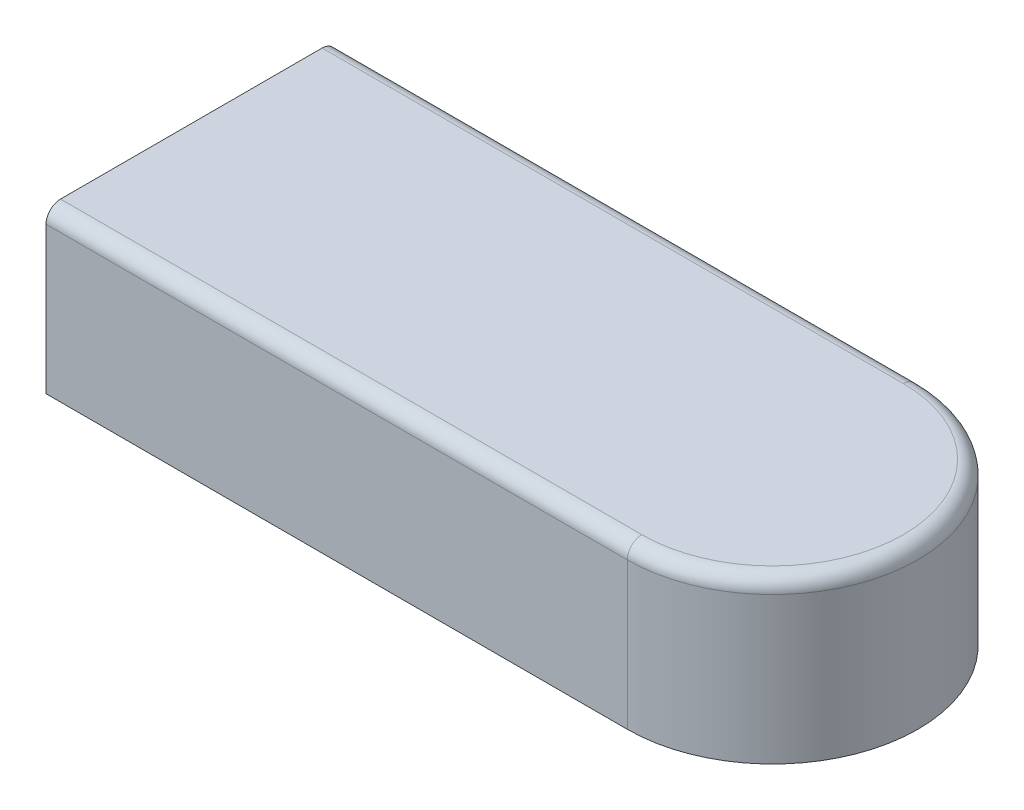
ISO-10303-21;
HEADER;
FILE_DESCRIPTION(('STEP AP214'),'2;1');
FILE_NAME('part.step','',(''),(''),'','','');
FILE_SCHEMA(('AUTOMOTIVE_DESIGN { 1 0 10303 214 1 1 1 1 }'));
ENDSEC;
DATA;
#1=APPLICATION_CONTEXT('core data for automotive mechanical design processes');
#2=APPLICATION_PROTOCOL_DEFINITION('international standard','automotive_design',2000,#1);
#3=PRODUCT_CONTEXT('',#1,'mechanical');
#4=PRODUCT('Part','Part','',(#3));
#5=PRODUCT_RELATED_PRODUCT_CATEGORY('part','',(#4));
#6=PRODUCT_DEFINITION_FORMATION('','',#4);
#7=PRODUCT_DEFINITION_CONTEXT('part definition',#1,'design');
#8=PRODUCT_DEFINITION('design','',#6,#7);
#9=PRODUCT_DEFINITION_SHAPE('','',#8);
#10=(LENGTH_UNIT() NAMED_UNIT(*) SI_UNIT(.MILLI.,.METRE.));
#11=(NAMED_UNIT(*) PLANE_ANGLE_UNIT() SI_UNIT($,.RADIAN.));
#12=(NAMED_UNIT(*) SI_UNIT($,.STERADIAN.) SOLID_ANGLE_UNIT());
#13=UNCERTAINTY_MEASURE_WITH_UNIT(LENGTH_MEASURE(1.E-05),#10,'distance_accuracy_value','');
#14=(GEOMETRIC_REPRESENTATION_CONTEXT(3) GLOBAL_UNCERTAINTY_ASSIGNED_CONTEXT((#13)) GLOBAL_UNIT_ASSIGNED_CONTEXT((#10,
#11,#12)) REPRESENTATION_CONTEXT('',''));
#15=CARTESIAN_POINT('',(0.,0.,0.));
#16=DIRECTION('',(0.,0.,1.));
#17=DIRECTION('',(1.,0.,0.));
#18=AXIS2_PLACEMENT_3D('',#15,#16,#17);
#19=CARTESIAN_POINT('',(56.6212046767663,-2.79399999999999,-12.9306309994996));
#20=DIRECTION('',(0.,1.,0.));
#21=DIRECTION('',(0.,0.,1.));
#22=AXIS2_PLACEMENT_3D('',#19,#20,#21);
#23=CYLINDRICAL_SURFACE('',#22,25.4);
#24=DIRECTION('',(0.,1.,0.));
#25=VECTOR('',#24,1.);
#26=CARTESIAN_POINT('',(56.6212046767663,-2.79399999999999,-38.3306309994996));
#27=LINE('',#26,#25);
#28=CARTESIAN_POINT('',(56.6212046767663,-2.79399999999999,-38.3306309994996));
#29=VERTEX_POINT('',#28);
#30=CARTESIAN_POINT('',(56.6212046767663,22.86,-38.3306309994996));
#31=VERTEX_POINT('',#30);
#32=EDGE_CURVE('E101',#29,#31,#27,.T.);
#33=ORIENTED_EDGE('',*,*,#32,.T.);
#34=CARTESIAN_POINT('',(56.6212046767663,22.86,-12.9306309994996));
#35=DIRECTION('',(0.,1.,0.));
#36=DIRECTION('',(0.,0.,1.));
#37=AXIS2_PLACEMENT_3D('',#34,#35,#36);
#38=CIRCLE('',#37,25.4);
#39=CARTESIAN_POINT('',(56.6212046767663,22.86,12.4693690005004));
#40=VERTEX_POINT('',#39);
#41=EDGE_CURVE('E46',#31,#40,#38,.F.);
#42=ORIENTED_EDGE('',*,*,#41,.T.);
#43=DIRECTION('',(0.,1.,0.));
#44=VECTOR('',#43,1.);
#45=CARTESIAN_POINT('',(56.6212046767663,-2.79399999999999,12.4693690005004));
#46=LINE('',#45,#44);
#47=CARTESIAN_POINT('',(56.6212046767663,-2.79399999999999,12.4693690005004));
#48=VERTEX_POINT('',#47);
#49=EDGE_CURVE('E109',#48,#40,#46,.T.);
#50=ORIENTED_EDGE('',*,*,#49,.F.);
#51=CARTESIAN_POINT('',(56.6212046767663,-2.79399999999999,-12.9306309994996));
#52=DIRECTION('',(0.,1.,0.));
#53=DIRECTION('',(0.,0.,1.));
#54=AXIS2_PLACEMENT_3D('',#51,#52,#53);
#55=CIRCLE('',#54,25.4);
#56=EDGE_CURVE('E96',#29,#48,#55,.F.);
#57=ORIENTED_EDGE('',*,*,#56,.F.);
#58=EDGE_LOOP('',(#33,#42,#50,#57));
#59=FACE_BOUND('',#58,.T.);
#60=ADVANCED_FACE('F37',(#59),#23,.T.);
#61=CARTESIAN_POINT('',(0.,-2.79399999999999,12.4693690005004));
#62=DIRECTION('',(0.,0.,1.));
#63=DIRECTION('',(1.,0.,0.));
#64=AXIS2_PLACEMENT_3D('',#61,#62,#63);
#65=PLANE('',#64);
#66=ORIENTED_EDGE('',*,*,#49,.T.);
#67=DIRECTION('',(1.,0.,0.));
#68=VECTOR('',#67,1.);
#69=CARTESIAN_POINT('',(0.,22.86,12.4693690005004));
#70=LINE('',#69,#68);
#71=CARTESIAN_POINT('',(-44.9787953232337,22.86,12.4693690005004));
#72=VERTEX_POINT('',#71);
#73=EDGE_CURVE('E130',#40,#72,#70,.F.);
#74=ORIENTED_EDGE('',*,*,#73,.T.);
#75=DIRECTION('',(0.,1.,0.));
#76=VECTOR('',#75,1.);
#77=CARTESIAN_POINT('',(-44.9787953232337,-2.79399999999999,12.4693690005004));
#78=LINE('',#77,#76);
#79=CARTESIAN_POINT('',(-44.9787953232337,-2.79399999999999,12.4693690005004));
#80=VERTEX_POINT('',#79);
#81=EDGE_CURVE('E120',#80,#72,#78,.T.);
#82=ORIENTED_EDGE('',*,*,#81,.F.);
#83=DIRECTION('',(1.,0.,0.));
#84=VECTOR('',#83,1.);
#85=CARTESIAN_POINT('',(0.,-2.79399999999999,12.4693690005004));
#86=LINE('',#85,#84);
#87=EDGE_CURVE('E106',#80,#48,#86,.T.);
#88=ORIENTED_EDGE('',*,*,#87,.T.);
#89=EDGE_LOOP('',(#66,#74,#82,#88));
#90=FACE_BOUND('',#89,.T.);
#91=ADVANCED_FACE('F153',(#90),#65,.T.);
#92=CARTESIAN_POINT('',(-44.9787953232337,-2.79399999999999,0.));
#93=DIRECTION('',(-1.,0.,0.));
#94=DIRECTION('',(0.,0.,1.));
#95=AXIS2_PLACEMENT_3D('',#92,#93,#94);
#96=PLANE('',#95);
#97=ORIENTED_EDGE('',*,*,#81,.T.);
#98=CARTESIAN_POINT('',(-44.9787953232337,22.86,9.92936900050041));
#99=DIRECTION('',(-1.,0.,0.));
#100=DIRECTION('',(0.,0.,1.));
#101=AXIS2_PLACEMENT_3D('',#98,#99,#100);
#102=CIRCLE('',#101,2.54);
#103=CARTESIAN_POINT('',(-44.9787953232337,25.4,9.92936900050041));
#104=VERTEX_POINT('',#103);
#105=EDGE_CURVE('E133',#72,#104,#102,.T.);
#106=ORIENTED_EDGE('',*,*,#105,.T.);
#107=DIRECTION('',(0.,0.,1.));
#108=VECTOR('',#107,1.);
#109=CARTESIAN_POINT('',(-44.9787953232337,25.4,0.));
#110=LINE('',#109,#108);
#111=CARTESIAN_POINT('',(-44.9787953232337,25.4,-35.7906309994996));
#112=VERTEX_POINT('',#111);
#113=EDGE_CURVE('E111',#112,#104,#110,.T.);
#114=ORIENTED_EDGE('',*,*,#113,.F.);
#115=CARTESIAN_POINT('',(-44.9787953232337,22.86,-35.7906309994996));
#116=DIRECTION('',(-1.,0.,0.));
#117=DIRECTION('',(0.,0.,1.));
#118=AXIS2_PLACEMENT_3D('',#115,#116,#117);
#119=CIRCLE('',#118,2.54);
#120=CARTESIAN_POINT('',(-44.9787953232337,22.86,-38.3306309994996));
#121=VERTEX_POINT('',#120);
#122=EDGE_CURVE('E60',#112,#121,#119,.T.);
#123=ORIENTED_EDGE('',*,*,#122,.T.);
#124=DIRECTION('',(0.,1.,0.));
#125=VECTOR('',#124,1.);
#126=CARTESIAN_POINT('',(-44.9787953232337,-2.79399999999999,-38.3306309994996));
#127=LINE('',#126,#125);
#128=CARTESIAN_POINT('',(-44.9787953232337,-2.79399999999999,-38.3306309994996));
#129=VERTEX_POINT('',#128);
#130=EDGE_CURVE('E105',#129,#121,#127,.T.);
#131=ORIENTED_EDGE('',*,*,#130,.F.);
#132=DIRECTION('',(0.,0.,1.));
#133=VECTOR('',#132,1.);
#134=CARTESIAN_POINT('',(-44.9787953232337,-2.79399999999999,0.));
#135=LINE('',#134,#133);
#136=EDGE_CURVE('E99',#129,#80,#135,.T.);
#137=ORIENTED_EDGE('',*,*,#136,.T.);
#138=EDGE_LOOP('',(#97,#106,#114,#123,#131,#137));
#139=FACE_BOUND('',#138,.T.);
#140=ADVANCED_FACE('F149',(#139),#96,.T.);
#141=CARTESIAN_POINT('',(0.,-2.79399999999999,-38.3306309994996));
#142=DIRECTION('',(0.,0.,1.));
#143=DIRECTION('',(1.,0.,0.));
#144=AXIS2_PLACEMENT_3D('',#141,#142,#143);
#145=PLANE('',#144);
#146=ORIENTED_EDGE('',*,*,#130,.T.);
#147=DIRECTION('',(1.,0.,0.));
#148=VECTOR('',#147,1.);
#149=CARTESIAN_POINT('',(56.6212046767663,22.86,-38.3306309994996));
#150=LINE('',#149,#148);
#151=EDGE_CURVE('E11',#121,#31,#150,.T.);
#152=ORIENTED_EDGE('',*,*,#151,.T.);
#153=ORIENTED_EDGE('',*,*,#32,.F.);
#154=DIRECTION('',(1.,0.,0.));
#155=VECTOR('',#154,1.);
#156=CARTESIAN_POINT('',(0.,-2.79399999999999,-38.3306309994996));
#157=LINE('',#156,#155);
#158=EDGE_CURVE('E92',#129,#29,#157,.T.);
#159=ORIENTED_EDGE('',*,*,#158,.F.);
#160=EDGE_LOOP('',(#146,#152,#153,#159));
#161=FACE_BOUND('',#160,.T.);
#162=ADVANCED_FACE('F102',(#161),#145,.F.);
#163=CARTESIAN_POINT('',(0.,-2.79399999999999,0.));
#164=DIRECTION('',(0.,1.,0.));
#165=DIRECTION('',(0.,0.,1.));
#166=AXIS2_PLACEMENT_3D('',#163,#164,#165);
#167=PLANE('',#166);
#168=ORIENTED_EDGE('',*,*,#56,.T.);
#169=ORIENTED_EDGE('',*,*,#87,.F.);
#170=ORIENTED_EDGE('',*,*,#136,.F.);
#171=ORIENTED_EDGE('',*,*,#158,.T.);
#172=EDGE_LOOP('',(#168,#169,#170,#171));
#173=FACE_BOUND('',#172,.T.);
#174=ADVANCED_FACE('F93',(#173),#167,.F.);
#175=CARTESIAN_POINT('',(0.,25.4,0.));
#176=DIRECTION('',(0.,1.,0.));
#177=DIRECTION('',(0.,0.,1.));
#178=AXIS2_PLACEMENT_3D('',#175,#176,#177);
#179=PLANE('',#178);
#180=ORIENTED_EDGE('',*,*,#113,.T.);
#181=DIRECTION('',(1.,0.,0.));
#182=VECTOR('',#181,1.);
#183=CARTESIAN_POINT('',(0.,25.4,9.92936900050041));
#184=LINE('',#183,#182);
#185=CARTESIAN_POINT('',(56.6212046767663,25.4,9.92936900050041));
#186=VERTEX_POINT('',#185);
#187=EDGE_CURVE('E127',#104,#186,#184,.T.);
#188=ORIENTED_EDGE('',*,*,#187,.T.);
#189=CARTESIAN_POINT('',(56.6212046767663,25.4,-12.9306309994996));
#190=DIRECTION('',(0.,1.,0.));
#191=DIRECTION('',(0.,0.,1.));
#192=AXIS2_PLACEMENT_3D('',#189,#190,#191);
#193=CIRCLE('',#192,22.86);
#194=CARTESIAN_POINT('',(56.6212046767663,25.4,-35.7906309994996));
#195=VERTEX_POINT('',#194);
#196=EDGE_CURVE('E125',#186,#195,#193,.T.);
#197=ORIENTED_EDGE('',*,*,#196,.T.);
#198=DIRECTION('',(1.,0.,0.));
#199=VECTOR('',#198,1.);
#200=CARTESIAN_POINT('',(-44.9787953232337,25.4,-35.7906309994996));
#201=LINE('',#200,#199);
#202=EDGE_CURVE('E119',#195,#112,#201,.F.);
#203=ORIENTED_EDGE('',*,*,#202,.T.);
#204=EDGE_LOOP('',(#180,#188,#197,#203));
#205=FACE_BOUND('',#204,.T.);
#206=ADVANCED_FACE('F148',(#205),#179,.T.);
#207=CARTESIAN_POINT('',(0.,22.86,-35.7906309994996));
#208=DIRECTION('',(-1.,0.,0.));
#209=DIRECTION('',(0.,0.,1.));
#210=AXIS2_PLACEMENT_3D('',#207,#208,#209);
#211=CYLINDRICAL_SURFACE('',#210,2.54);
#212=ORIENTED_EDGE('',*,*,#122,.F.);
#213=ORIENTED_EDGE('',*,*,#202,.F.);
#214=CARTESIAN_POINT('',(56.6212046767663,22.86,-35.7906309994996));
#215=DIRECTION('',(1.,0.,0.));
#216=DIRECTION('',(0.,0.,-1.));
#217=AXIS2_PLACEMENT_3D('',#214,#215,#216);
#218=CIRCLE('',#217,2.54);
#219=EDGE_CURVE('E41',#31,#195,#218,.T.);
#220=ORIENTED_EDGE('',*,*,#219,.F.);
#221=ORIENTED_EDGE('',*,*,#151,.F.);
#222=EDGE_LOOP('',(#212,#213,#220,#221));
#223=FACE_BOUND('',#222,.T.);
#224=ADVANCED_FACE('F39',(#223),#211,.T.);
#225=CARTESIAN_POINT('',(56.6212046767663,22.86,-12.9306309994996));
#226=DIRECTION('',(0.,1.,0.));
#227=DIRECTION('',(0.,0.,1.));
#228=AXIS2_PLACEMENT_3D('',#225,#226,#227);
#229=TOROIDAL_SURFACE('',#228,22.86,2.54);
#230=ORIENTED_EDGE('',*,*,#219,.T.);
#231=ORIENTED_EDGE('',*,*,#196,.F.);
#232=CARTESIAN_POINT('',(56.6212046767663,22.86,9.92936900050041));
#233=DIRECTION('',(-1.,0.,0.));
#234=DIRECTION('',(0.,0.,1.));
#235=AXIS2_PLACEMENT_3D('',#232,#233,#234);
#236=CIRCLE('',#235,2.54);
#237=EDGE_CURVE('E135',#40,#186,#236,.T.);
#238=ORIENTED_EDGE('',*,*,#237,.F.);
#239=ORIENTED_EDGE('',*,*,#41,.F.);
#240=EDGE_LOOP('',(#230,#231,#238,#239));
#241=FACE_BOUND('',#240,.T.);
#242=ADVANCED_FACE('F144',(#241),#229,.T.);
#243=CARTESIAN_POINT('',(0.,22.86,9.92936900050041));
#244=DIRECTION('',(1.,0.,0.));
#245=DIRECTION('',(0.,0.,-1.));
#246=AXIS2_PLACEMENT_3D('',#243,#244,#245);
#247=CYLINDRICAL_SURFACE('',#246,2.54);
#248=ORIENTED_EDGE('',*,*,#105,.F.);
#249=ORIENTED_EDGE('',*,*,#73,.F.);
#250=ORIENTED_EDGE('',*,*,#237,.T.);
#251=ORIENTED_EDGE('',*,*,#187,.F.);
#252=EDGE_LOOP('',(#248,#249,#250,#251));
#253=FACE_BOUND('',#252,.T.);
#254=ADVANCED_FACE('F151',(#253),#247,.T.);
#255=CLOSED_SHELL('',(#60,#91,#140,#162,#174,#206,#224,#242,#254));
#256=MANIFOLD_SOLID_BREP('B2',#255);
#257=ADVANCED_BREP_SHAPE_REPRESENTATION('',(#18,#256),#14);
#258=SHAPE_DEFINITION_REPRESENTATION(#9,#257);
ENDSEC;
END-ISO-10303-21;
